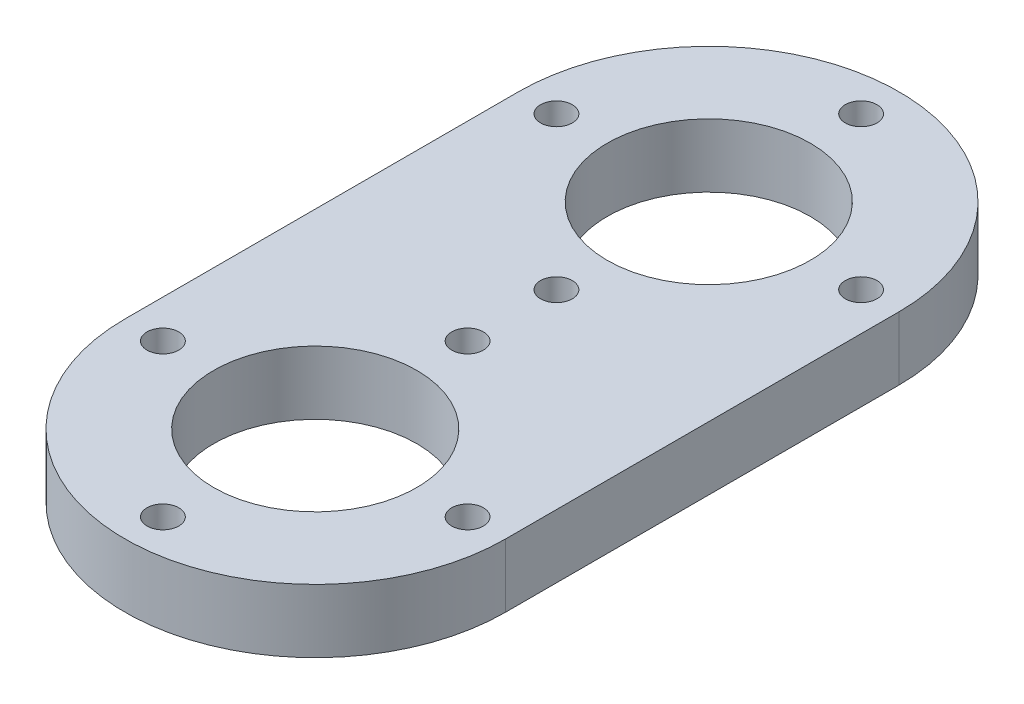
ISO-10303-21;
HEADER;
FILE_DESCRIPTION(('STEP AP214'),'2;1');
FILE_NAME('part.step','',(''),(''),'','','');
FILE_SCHEMA(('AUTOMOTIVE_DESIGN { 1 0 10303 214 1 1 1 1 }'));
ENDSEC;
DATA;
#1=APPLICATION_CONTEXT('core data for automotive mechanical design processes');
#2=APPLICATION_PROTOCOL_DEFINITION('international standard','automotive_design',2000,#1);
#3=PRODUCT_CONTEXT('',#1,'mechanical');
#4=PRODUCT('Part','Part','',(#3));
#5=PRODUCT_RELATED_PRODUCT_CATEGORY('part','',(#4));
#6=PRODUCT_DEFINITION_FORMATION('','',#4);
#7=PRODUCT_DEFINITION_CONTEXT('part definition',#1,'design');
#8=PRODUCT_DEFINITION('design','',#6,#7);
#9=PRODUCT_DEFINITION_SHAPE('','',#8);
#10=(LENGTH_UNIT() NAMED_UNIT(*) SI_UNIT(.MILLI.,.METRE.));
#11=(NAMED_UNIT(*) PLANE_ANGLE_UNIT() SI_UNIT($,.RADIAN.));
#12=(NAMED_UNIT(*) SI_UNIT($,.STERADIAN.) SOLID_ANGLE_UNIT());
#13=UNCERTAINTY_MEASURE_WITH_UNIT(LENGTH_MEASURE(1.E-05),#10,'distance_accuracy_value','');
#14=(GEOMETRIC_REPRESENTATION_CONTEXT(3) GLOBAL_UNCERTAINTY_ASSIGNED_CONTEXT((#13)) GLOBAL_UNIT_ASSIGNED_CONTEXT((#10,
#11,#12)) REPRESENTATION_CONTEXT('',''));
#15=CARTESIAN_POINT('',(0.,0.,0.));
#16=DIRECTION('',(0.,0.,1.));
#17=DIRECTION('',(1.,0.,0.));
#18=AXIS2_PLACEMENT_3D('',#15,#16,#17);
#19=CARTESIAN_POINT('',(0.,10.,-31.));
#20=DIRECTION('',(0.,1.,0.));
#21=DIRECTION('',(0.,0.,1.));
#22=AXIS2_PLACEMENT_3D('',#19,#20,#21);
#23=PLANE('',#22);
#24=CARTESIAN_POINT('',(24.,10.,31.));
#25=DIRECTION('',(0.,-1.,0.));
#26=DIRECTION('',(0.,0.,-1.));
#27=AXIS2_PLACEMENT_3D('',#24,#25,#26);
#28=CIRCLE('',#27,2.5);
#29=CARTESIAN_POINT('',(24.,10.,28.5));
#30=VERTEX_POINT('',#29);
#31=EDGE_CURVE('E173',#30,#30,#28,.T.);
#32=ORIENTED_EDGE('',*,*,#31,.T.);
#33=EDGE_LOOP('',(#32));
#34=FACE_BOUND('',#33,.T.);
#35=CARTESIAN_POINT('',(0.,10.,55.));
#36=DIRECTION('',(0.,-1.,0.));
#37=DIRECTION('',(1.,0.,0.));
#38=AXIS2_PLACEMENT_3D('',#35,#36,#37);
#39=CIRCLE('',#38,2.5);
#40=CARTESIAN_POINT('',(2.49999999999991,10.,55.));
#41=VERTEX_POINT('',#40);
#42=EDGE_CURVE('E167',#41,#41,#39,.T.);
#43=ORIENTED_EDGE('',*,*,#42,.T.);
#44=EDGE_LOOP('',(#43));
#45=FACE_BOUND('',#44,.T.);
#46=CARTESIAN_POINT('',(-24.,10.,31.));
#47=DIRECTION('',(0.,-1.,0.));
#48=DIRECTION('',(0.,0.,1.));
#49=AXIS2_PLACEMENT_3D('',#46,#47,#48);
#50=CIRCLE('',#49,2.5);
#51=CARTESIAN_POINT('',(-24.,10.,33.5));
#52=VERTEX_POINT('',#51);
#53=EDGE_CURVE('E161',#52,#52,#50,.T.);
#54=ORIENTED_EDGE('',*,*,#53,.T.);
#55=EDGE_LOOP('',(#54));
#56=FACE_BOUND('',#55,.T.);
#57=CARTESIAN_POINT('',(2.39391839684799E-13,10.,7.));
#58=DIRECTION('',(0.,-1.,0.));
#59=DIRECTION('',(-1.,0.,0.));
#60=AXIS2_PLACEMENT_3D('',#57,#58,#59);
#61=CIRCLE('',#60,2.5);
#62=CARTESIAN_POINT('',(-2.49999999999976,10.,6.99999999999997));
#63=VERTEX_POINT('',#62);
#64=EDGE_CURVE('E155',#63,#63,#61,.T.);
#65=ORIENTED_EDGE('',*,*,#64,.T.);
#66=EDGE_LOOP('',(#65));
#67=FACE_BOUND('',#66,.T.);
#68=CARTESIAN_POINT('',(0.,10.,-55.));
#69=DIRECTION('',(0.,1.,0.));
#70=DIRECTION('',(1.,0.,0.));
#71=AXIS2_PLACEMENT_3D('',#68,#69,#70);
#72=CIRCLE('',#71,2.5);
#73=CARTESIAN_POINT('',(2.49999999999991,10.,-55.));
#74=VERTEX_POINT('',#73);
#75=EDGE_CURVE('E150',#74,#74,#72,.T.);
#76=ORIENTED_EDGE('',*,*,#75,.F.);
#77=EDGE_LOOP('',(#76));
#78=FACE_BOUND('',#77,.T.);
#79=CARTESIAN_POINT('',(-24.,10.,-31.));
#80=DIRECTION('',(0.,1.,0.));
#81=DIRECTION('',(0.,0.,-1.));
#82=AXIS2_PLACEMENT_3D('',#79,#80,#81);
#83=CIRCLE('',#82,2.5);
#84=CARTESIAN_POINT('',(-24.,10.,-33.5));
#85=VERTEX_POINT('',#84);
#86=EDGE_CURVE('E144',#85,#85,#83,.T.);
#87=ORIENTED_EDGE('',*,*,#86,.F.);
#88=EDGE_LOOP('',(#87));
#89=FACE_BOUND('',#88,.T.);
#90=CARTESIAN_POINT('',(2.39391839684799E-13,10.,-7.));
#91=DIRECTION('',(0.,1.,0.));
#92=DIRECTION('',(-1.,0.,0.));
#93=AXIS2_PLACEMENT_3D('',#90,#91,#92);
#94=CIRCLE('',#93,2.5);
#95=CARTESIAN_POINT('',(-2.49999999999976,10.,-6.99999999999997));
#96=VERTEX_POINT('',#95);
#97=EDGE_CURVE('E137',#96,#96,#94,.T.);
#98=ORIENTED_EDGE('',*,*,#97,.F.);
#99=EDGE_LOOP('',(#98));
#100=FACE_BOUND('',#99,.T.);
#101=CARTESIAN_POINT('',(24.,10.,-31.));
#102=DIRECTION('',(0.,1.,0.));
#103=DIRECTION('',(0.,0.,1.));
#104=AXIS2_PLACEMENT_3D('',#101,#102,#103);
#105=CIRCLE('',#104,2.5);
#106=CARTESIAN_POINT('',(24.,10.,-28.5));
#107=VERTEX_POINT('',#106);
#108=EDGE_CURVE('E131',#107,#107,#105,.T.);
#109=ORIENTED_EDGE('',*,*,#108,.F.);
#110=EDGE_LOOP('',(#109));
#111=FACE_BOUND('',#110,.T.);
#112=CARTESIAN_POINT('',(0.,10.,31.));
#113=DIRECTION('',(0.,1.,0.));
#114=DIRECTION('',(0.,0.,1.));
#115=AXIS2_PLACEMENT_3D('',#112,#113,#114);
#116=CIRCLE('',#115,16.);
#117=CARTESIAN_POINT('',(0.,10.,47.));
#118=VERTEX_POINT('',#117);
#119=EDGE_CURVE('E107',#118,#118,#116,.T.);
#120=ORIENTED_EDGE('',*,*,#119,.F.);
#121=EDGE_LOOP('',(#120));
#122=FACE_BOUND('',#121,.T.);
#123=CARTESIAN_POINT('',(0.,10.,-31.));
#124=DIRECTION('',(0.,1.,0.));
#125=DIRECTION('',(0.,0.,1.));
#126=AXIS2_PLACEMENT_3D('',#123,#124,#125);
#127=CIRCLE('',#126,30.);
#128=CARTESIAN_POINT('',(30.,10.,-31.));
#129=VERTEX_POINT('',#128);
#130=CARTESIAN_POINT('',(-30.,10.,-31.));
#131=VERTEX_POINT('',#130);
#132=EDGE_CURVE('E92',#129,#131,#127,.T.);
#133=ORIENTED_EDGE('',*,*,#132,.T.);
#134=DIRECTION('',(0.,0.,1.));
#135=VECTOR('',#134,1.);
#136=CARTESIAN_POINT('',(-30.,10.,-31.));
#137=LINE('',#136,#135);
#138=CARTESIAN_POINT('',(-30.,10.,31.));
#139=VERTEX_POINT('',#138);
#140=EDGE_CURVE('E87',#131,#139,#137,.T.);
#141=ORIENTED_EDGE('',*,*,#140,.T.);
#142=CARTESIAN_POINT('',(0.,10.,31.));
#143=DIRECTION('',(0.,1.,0.));
#144=DIRECTION('',(0.,0.,1.));
#145=AXIS2_PLACEMENT_3D('',#142,#143,#144);
#146=CIRCLE('',#145,30.);
#147=CARTESIAN_POINT('',(30.,10.,31.));
#148=VERTEX_POINT('',#147);
#149=EDGE_CURVE('E90',#139,#148,#146,.T.);
#150=ORIENTED_EDGE('',*,*,#149,.T.);
#151=DIRECTION('',(0.,0.,-1.));
#152=VECTOR('',#151,1.);
#153=CARTESIAN_POINT('',(30.,10.,-31.));
#154=LINE('',#153,#152);
#155=EDGE_CURVE('E57',#148,#129,#154,.T.);
#156=ORIENTED_EDGE('',*,*,#155,.T.);
#157=EDGE_LOOP('',(#133,#141,#150,#156));
#158=FACE_BOUND('',#157,.T.);
#159=CARTESIAN_POINT('',(0.,10.,-31.));
#160=DIRECTION('',(0.,1.,0.));
#161=DIRECTION('',(0.,0.,1.));
#162=AXIS2_PLACEMENT_3D('',#159,#160,#161);
#163=CIRCLE('',#162,16.);
#164=CARTESIAN_POINT('',(0.,10.,-15.));
#165=VERTEX_POINT('',#164);
#166=EDGE_CURVE('E122',#165,#165,#163,.T.);
#167=ORIENTED_EDGE('',*,*,#166,.F.);
#168=EDGE_LOOP('',(#167));
#169=FACE_BOUND('',#168,.T.);
#170=ADVANCED_FACE('F40',(#34,#45,#56,#67,#78,#89,#100,#111,#122,#158,#169),#23,.T.);
#171=CARTESIAN_POINT('',(0.,0.,-31.));
#172=DIRECTION('',(0.,1.,0.));
#173=DIRECTION('',(0.,0.,1.));
#174=AXIS2_PLACEMENT_3D('',#171,#172,#173);
#175=PLANE('',#174);
#176=CARTESIAN_POINT('',(24.,0.,31.));
#177=DIRECTION('',(0.,-1.,0.));
#178=DIRECTION('',(0.,0.,-1.));
#179=AXIS2_PLACEMENT_3D('',#176,#177,#178);
#180=CIRCLE('',#179,2.5);
#181=CARTESIAN_POINT('',(24.,0.,28.5));
#182=VERTEX_POINT('',#181);
#183=EDGE_CURVE('E141',#182,#182,#180,.T.);
#184=ORIENTED_EDGE('',*,*,#183,.F.);
#185=EDGE_LOOP('',(#184));
#186=FACE_BOUND('',#185,.T.);
#187=CARTESIAN_POINT('',(0.,0.,55.));
#188=DIRECTION('',(0.,-1.,0.));
#189=DIRECTION('',(1.,0.,0.));
#190=AXIS2_PLACEMENT_3D('',#187,#188,#189);
#191=CIRCLE('',#190,2.5);
#192=CARTESIAN_POINT('',(2.49999999999991,0.,55.));
#193=VERTEX_POINT('',#192);
#194=EDGE_CURVE('E170',#193,#193,#191,.T.);
#195=ORIENTED_EDGE('',*,*,#194,.F.);
#196=EDGE_LOOP('',(#195));
#197=FACE_BOUND('',#196,.T.);
#198=CARTESIAN_POINT('',(-24.,0.,31.));
#199=DIRECTION('',(0.,-1.,0.));
#200=DIRECTION('',(0.,0.,1.));
#201=AXIS2_PLACEMENT_3D('',#198,#199,#200);
#202=CIRCLE('',#201,2.5);
#203=CARTESIAN_POINT('',(-24.,0.,33.5));
#204=VERTEX_POINT('',#203);
#205=EDGE_CURVE('E164',#204,#204,#202,.T.);
#206=ORIENTED_EDGE('',*,*,#205,.F.);
#207=EDGE_LOOP('',(#206));
#208=FACE_BOUND('',#207,.T.);
#209=CARTESIAN_POINT('',(2.39391839684799E-13,0.,7.));
#210=DIRECTION('',(0.,-1.,0.));
#211=DIRECTION('',(-1.,0.,0.));
#212=AXIS2_PLACEMENT_3D('',#209,#210,#211);
#213=CIRCLE('',#212,2.5);
#214=CARTESIAN_POINT('',(-2.49999999999976,0.,6.99999999999997));
#215=VERTEX_POINT('',#214);
#216=EDGE_CURVE('E158',#215,#215,#213,.T.);
#217=ORIENTED_EDGE('',*,*,#216,.F.);
#218=EDGE_LOOP('',(#217));
#219=FACE_BOUND('',#218,.T.);
#220=CARTESIAN_POINT('',(0.,0.,-55.));
#221=DIRECTION('',(0.,1.,0.));
#222=DIRECTION('',(1.,0.,0.));
#223=AXIS2_PLACEMENT_3D('',#220,#221,#222);
#224=CIRCLE('',#223,2.5);
#225=CARTESIAN_POINT('',(2.49999999999991,0.,-55.));
#226=VERTEX_POINT('',#225);
#227=EDGE_CURVE('E134',#226,#226,#224,.T.);
#228=ORIENTED_EDGE('',*,*,#227,.T.);
#229=EDGE_LOOP('',(#228));
#230=FACE_BOUND('',#229,.T.);
#231=CARTESIAN_POINT('',(-24.,0.,-31.));
#232=DIRECTION('',(0.,1.,0.));
#233=DIRECTION('',(0.,0.,-1.));
#234=AXIS2_PLACEMENT_3D('',#231,#232,#233);
#235=CIRCLE('',#234,2.5);
#236=CARTESIAN_POINT('',(-24.,0.,-33.5));
#237=VERTEX_POINT('',#236);
#238=EDGE_CURVE('E147',#237,#237,#235,.T.);
#239=ORIENTED_EDGE('',*,*,#238,.T.);
#240=EDGE_LOOP('',(#239));
#241=FACE_BOUND('',#240,.T.);
#242=CARTESIAN_POINT('',(2.39391839684799E-13,0.,-7.));
#243=DIRECTION('',(0.,1.,0.));
#244=DIRECTION('',(-1.,0.,0.));
#245=AXIS2_PLACEMENT_3D('',#242,#243,#244);
#246=CIRCLE('',#245,2.5);
#247=CARTESIAN_POINT('',(-2.49999999999976,0.,-6.99999999999997));
#248=VERTEX_POINT('',#247);
#249=EDGE_CURVE('E140',#248,#248,#246,.T.);
#250=ORIENTED_EDGE('',*,*,#249,.T.);
#251=EDGE_LOOP('',(#250));
#252=FACE_BOUND('',#251,.T.);
#253=CARTESIAN_POINT('',(24.,0.,-31.));
#254=DIRECTION('',(0.,1.,0.));
#255=DIRECTION('',(0.,0.,1.));
#256=AXIS2_PLACEMENT_3D('',#253,#254,#255);
#257=CIRCLE('',#256,2.5);
#258=CARTESIAN_POINT('',(24.,0.,-28.5));
#259=VERTEX_POINT('',#258);
#260=EDGE_CURVE('E128',#259,#259,#257,.T.);
#261=ORIENTED_EDGE('',*,*,#260,.T.);
#262=EDGE_LOOP('',(#261));
#263=FACE_BOUND('',#262,.T.);
#264=CARTESIAN_POINT('',(0.,0.,-31.));
#265=DIRECTION('',(0.,1.,0.));
#266=DIRECTION('',(0.,0.,1.));
#267=AXIS2_PLACEMENT_3D('',#264,#265,#266);
#268=CIRCLE('',#267,30.);
#269=CARTESIAN_POINT('',(30.,0.,-31.));
#270=VERTEX_POINT('',#269);
#271=CARTESIAN_POINT('',(-30.,0.,-31.));
#272=VERTEX_POINT('',#271);
#273=EDGE_CURVE('E104',#270,#272,#268,.T.);
#274=ORIENTED_EDGE('',*,*,#273,.F.);
#275=DIRECTION('',(0.,0.,-1.));
#276=VECTOR('',#275,1.);
#277=CARTESIAN_POINT('',(30.,0.,-31.));
#278=LINE('',#277,#276);
#279=CARTESIAN_POINT('',(30.,0.,31.));
#280=VERTEX_POINT('',#279);
#281=EDGE_CURVE('E80',#280,#270,#278,.T.);
#282=ORIENTED_EDGE('',*,*,#281,.F.);
#283=CARTESIAN_POINT('',(0.,0.,31.));
#284=DIRECTION('',(0.,1.,0.));
#285=DIRECTION('',(0.,0.,1.));
#286=AXIS2_PLACEMENT_3D('',#283,#284,#285);
#287=CIRCLE('',#286,30.);
#288=CARTESIAN_POINT('',(-30.,0.,31.));
#289=VERTEX_POINT('',#288);
#290=EDGE_CURVE('E74',#289,#280,#287,.T.);
#291=ORIENTED_EDGE('',*,*,#290,.F.);
#292=DIRECTION('',(0.,0.,1.));
#293=VECTOR('',#292,1.);
#294=CARTESIAN_POINT('',(-30.,0.,-31.));
#295=LINE('',#294,#293);
#296=EDGE_CURVE('E96',#272,#289,#295,.T.);
#297=ORIENTED_EDGE('',*,*,#296,.F.);
#298=EDGE_LOOP('',(#274,#282,#291,#297));
#299=FACE_BOUND('',#298,.T.);
#300=CARTESIAN_POINT('',(0.,0.,31.));
#301=DIRECTION('',(0.,1.,0.));
#302=DIRECTION('',(0.,0.,1.));
#303=AXIS2_PLACEMENT_3D('',#300,#301,#302);
#304=CIRCLE('',#303,16.);
#305=CARTESIAN_POINT('',(0.,0.,47.));
#306=VERTEX_POINT('',#305);
#307=EDGE_CURVE('E119',#306,#306,#304,.T.);
#308=ORIENTED_EDGE('',*,*,#307,.T.);
#309=EDGE_LOOP('',(#308));
#310=FACE_BOUND('',#309,.T.);
#311=CARTESIAN_POINT('',(0.,0.,-31.));
#312=DIRECTION('',(0.,1.,0.));
#313=DIRECTION('',(0.,0.,1.));
#314=AXIS2_PLACEMENT_3D('',#311,#312,#313);
#315=CIRCLE('',#314,16.);
#316=CARTESIAN_POINT('',(0.,0.,-15.));
#317=VERTEX_POINT('',#316);
#318=EDGE_CURVE('E125',#317,#317,#315,.T.);
#319=ORIENTED_EDGE('',*,*,#318,.T.);
#320=EDGE_LOOP('',(#319));
#321=FACE_BOUND('',#320,.T.);
#322=ADVANCED_FACE('F115',(#186,#197,#208,#219,#230,#241,#252,#263,#299,#310,#321),#175,.F.);
#323=CARTESIAN_POINT('',(0.,10.,-31.));
#324=DIRECTION('',(0.,-1.,0.));
#325=DIRECTION('',(0.,0.,-1.));
#326=AXIS2_PLACEMENT_3D('',#323,#324,#325);
#327=CYLINDRICAL_SURFACE('',#326,30.);
#328=ORIENTED_EDGE('',*,*,#273,.T.);
#329=DIRECTION('',(0.,-1.,0.));
#330=VECTOR('',#329,1.);
#331=CARTESIAN_POINT('',(-30.,10.,-31.));
#332=LINE('',#331,#330);
#333=EDGE_CURVE('E11',#131,#272,#332,.T.);
#334=ORIENTED_EDGE('',*,*,#333,.F.);
#335=ORIENTED_EDGE('',*,*,#132,.F.);
#336=DIRECTION('',(0.,-1.,0.));
#337=VECTOR('',#336,1.);
#338=CARTESIAN_POINT('',(30.,10.,-31.));
#339=LINE('',#338,#337);
#340=EDGE_CURVE('E100',#129,#270,#339,.T.);
#341=ORIENTED_EDGE('',*,*,#340,.T.);
#342=EDGE_LOOP('',(#328,#334,#335,#341));
#343=FACE_BOUND('',#342,.T.);
#344=ADVANCED_FACE('F42',(#343),#327,.T.);
#345=CARTESIAN_POINT('',(-30.,10.,-31.));
#346=DIRECTION('',(1.,0.,0.));
#347=DIRECTION('',(0.,0.,-1.));
#348=AXIS2_PLACEMENT_3D('',#345,#346,#347);
#349=PLANE('',#348);
#350=ORIENTED_EDGE('',*,*,#296,.T.);
#351=DIRECTION('',(0.,-1.,0.));
#352=VECTOR('',#351,1.);
#353=CARTESIAN_POINT('',(-30.,10.,31.));
#354=LINE('',#353,#352);
#355=EDGE_CURVE('E49',#139,#289,#354,.T.);
#356=ORIENTED_EDGE('',*,*,#355,.F.);
#357=ORIENTED_EDGE('',*,*,#140,.F.);
#358=ORIENTED_EDGE('',*,*,#333,.T.);
#359=EDGE_LOOP('',(#350,#356,#357,#358));
#360=FACE_BOUND('',#359,.T.);
#361=ADVANCED_FACE('F95',(#360),#349,.F.);
#362=CARTESIAN_POINT('',(0.,10.,31.));
#363=DIRECTION('',(0.,-1.,0.));
#364=DIRECTION('',(0.,0.,-1.));
#365=AXIS2_PLACEMENT_3D('',#362,#363,#364);
#366=CYLINDRICAL_SURFACE('',#365,30.);
#367=ORIENTED_EDGE('',*,*,#290,.T.);
#368=DIRECTION('',(0.,-1.,0.));
#369=VECTOR('',#368,1.);
#370=CARTESIAN_POINT('',(30.,10.,31.));
#371=LINE('',#370,#369);
#372=EDGE_CURVE('E97',#148,#280,#371,.T.);
#373=ORIENTED_EDGE('',*,*,#372,.F.);
#374=ORIENTED_EDGE('',*,*,#149,.F.);
#375=ORIENTED_EDGE('',*,*,#355,.T.);
#376=EDGE_LOOP('',(#367,#373,#374,#375));
#377=FACE_BOUND('',#376,.T.);
#378=ADVANCED_FACE('F98',(#377),#366,.T.);
#379=CARTESIAN_POINT('',(30.,10.,-31.));
#380=DIRECTION('',(-1.,0.,0.));
#381=DIRECTION('',(0.,0.,1.));
#382=AXIS2_PLACEMENT_3D('',#379,#380,#381);
#383=PLANE('',#382);
#384=ORIENTED_EDGE('',*,*,#281,.T.);
#385=ORIENTED_EDGE('',*,*,#340,.F.);
#386=ORIENTED_EDGE('',*,*,#155,.F.);
#387=ORIENTED_EDGE('',*,*,#372,.T.);
#388=EDGE_LOOP('',(#384,#385,#386,#387));
#389=FACE_BOUND('',#388,.T.);
#390=ADVANCED_FACE('F112',(#389),#383,.F.);
#391=CARTESIAN_POINT('',(0.,10.,31.));
#392=DIRECTION('',(0.,-1.,0.));
#393=DIRECTION('',(0.,0.,-1.));
#394=AXIS2_PLACEMENT_3D('',#391,#392,#393);
#395=CYLINDRICAL_SURFACE('',#394,16.);
#396=ORIENTED_EDGE('',*,*,#119,.T.);
#397=EDGE_LOOP('',(#396));
#398=FACE_BOUND('',#397,.T.);
#399=ORIENTED_EDGE('',*,*,#307,.F.);
#400=EDGE_LOOP('',(#399));
#401=FACE_BOUND('',#400,.T.);
#402=ADVANCED_FACE('F213',(#398,#401),#395,.F.);
#403=CARTESIAN_POINT('',(0.,10.,-31.));
#404=DIRECTION('',(0.,-1.,0.));
#405=DIRECTION('',(0.,0.,-1.));
#406=AXIS2_PLACEMENT_3D('',#403,#404,#405);
#407=CYLINDRICAL_SURFACE('',#406,16.);
#408=ORIENTED_EDGE('',*,*,#166,.T.);
#409=EDGE_LOOP('',(#408));
#410=FACE_BOUND('',#409,.T.);
#411=ORIENTED_EDGE('',*,*,#318,.F.);
#412=EDGE_LOOP('',(#411));
#413=FACE_BOUND('',#412,.T.);
#414=ADVANCED_FACE('F203',(#410,#413),#407,.F.);
#415=CARTESIAN_POINT('',(24.,0.,-31.));
#416=DIRECTION('',(0.,1.,0.));
#417=DIRECTION('',(0.,0.,1.));
#418=AXIS2_PLACEMENT_3D('',#415,#416,#417);
#419=CYLINDRICAL_SURFACE('',#418,2.5);
#420=ORIENTED_EDGE('',*,*,#260,.F.);
#421=EDGE_LOOP('',(#420));
#422=FACE_BOUND('',#421,.T.);
#423=ORIENTED_EDGE('',*,*,#108,.T.);
#424=EDGE_LOOP('',(#423));
#425=FACE_BOUND('',#424,.T.);
#426=ADVANCED_FACE('F199',(#422,#425),#419,.F.);
#427=CARTESIAN_POINT('',(2.39391839684799E-13,0.,-7.));
#428=DIRECTION('',(0.,1.,0.));
#429=DIRECTION('',(0.,0.,1.));
#430=AXIS2_PLACEMENT_3D('',#427,#428,#429);
#431=CYLINDRICAL_SURFACE('',#430,2.5);
#432=ORIENTED_EDGE('',*,*,#249,.F.);
#433=EDGE_LOOP('',(#432));
#434=FACE_BOUND('',#433,.T.);
#435=ORIENTED_EDGE('',*,*,#97,.T.);
#436=EDGE_LOOP('',(#435));
#437=FACE_BOUND('',#436,.T.);
#438=ADVANCED_FACE('F202',(#434,#437),#431,.F.);
#439=CARTESIAN_POINT('',(-24.,0.,-31.));
#440=DIRECTION('',(0.,1.,0.));
#441=DIRECTION('',(0.,0.,1.));
#442=AXIS2_PLACEMENT_3D('',#439,#440,#441);
#443=CYLINDRICAL_SURFACE('',#442,2.5);
#444=ORIENTED_EDGE('',*,*,#238,.F.);
#445=EDGE_LOOP('',(#444));
#446=FACE_BOUND('',#445,.T.);
#447=ORIENTED_EDGE('',*,*,#86,.T.);
#448=EDGE_LOOP('',(#447));
#449=FACE_BOUND('',#448,.T.);
#450=ADVANCED_FACE('F258',(#446,#449),#443,.F.);
#451=CARTESIAN_POINT('',(0.,0.,-55.));
#452=DIRECTION('',(0.,1.,0.));
#453=DIRECTION('',(0.,0.,1.));
#454=AXIS2_PLACEMENT_3D('',#451,#452,#453);
#455=CYLINDRICAL_SURFACE('',#454,2.5);
#456=ORIENTED_EDGE('',*,*,#227,.F.);
#457=EDGE_LOOP('',(#456));
#458=FACE_BOUND('',#457,.T.);
#459=ORIENTED_EDGE('',*,*,#75,.T.);
#460=EDGE_LOOP('',(#459));
#461=FACE_BOUND('',#460,.T.);
#462=ADVANCED_FACE('F252',(#458,#461),#455,.F.);
#463=CARTESIAN_POINT('',(2.39391839684799E-13,0.,7.));
#464=DIRECTION('',(0.,1.,0.));
#465=DIRECTION('',(0.,0.,1.));
#466=AXIS2_PLACEMENT_3D('',#463,#464,#465);
#467=CYLINDRICAL_SURFACE('',#466,2.5);
#468=ORIENTED_EDGE('',*,*,#216,.T.);
#469=EDGE_LOOP('',(#468));
#470=FACE_BOUND('',#469,.T.);
#471=ORIENTED_EDGE('',*,*,#64,.F.);
#472=EDGE_LOOP('',(#471));
#473=FACE_BOUND('',#472,.T.);
#474=ADVANCED_FACE('F257',(#470,#473),#467,.F.);
#475=CARTESIAN_POINT('',(-24.,0.,31.));
#476=DIRECTION('',(0.,1.,0.));
#477=DIRECTION('',(0.,0.,1.));
#478=AXIS2_PLACEMENT_3D('',#475,#476,#477);
#479=CYLINDRICAL_SURFACE('',#478,2.5);
#480=ORIENTED_EDGE('',*,*,#205,.T.);
#481=EDGE_LOOP('',(#480));
#482=FACE_BOUND('',#481,.T.);
#483=ORIENTED_EDGE('',*,*,#53,.F.);
#484=EDGE_LOOP('',(#483));
#485=FACE_BOUND('',#484,.T.);
#486=ADVANCED_FACE('F344',(#482,#485),#479,.F.);
#487=CARTESIAN_POINT('',(0.,0.,55.));
#488=DIRECTION('',(0.,1.,0.));
#489=DIRECTION('',(0.,0.,1.));
#490=AXIS2_PLACEMENT_3D('',#487,#488,#489);
#491=CYLINDRICAL_SURFACE('',#490,2.5);
#492=ORIENTED_EDGE('',*,*,#194,.T.);
#493=EDGE_LOOP('',(#492));
#494=FACE_BOUND('',#493,.T.);
#495=ORIENTED_EDGE('',*,*,#42,.F.);
#496=EDGE_LOOP('',(#495));
#497=FACE_BOUND('',#496,.T.);
#498=ADVANCED_FACE('F353',(#494,#497),#491,.F.);
#499=CARTESIAN_POINT('',(24.,0.,31.));
#500=DIRECTION('',(0.,1.,0.));
#501=DIRECTION('',(0.,0.,1.));
#502=AXIS2_PLACEMENT_3D('',#499,#500,#501);
#503=CYLINDRICAL_SURFACE('',#502,2.5);
#504=ORIENTED_EDGE('',*,*,#183,.T.);
#505=EDGE_LOOP('',(#504));
#506=FACE_BOUND('',#505,.T.);
#507=ORIENTED_EDGE('',*,*,#31,.F.);
#508=EDGE_LOOP('',(#507));
#509=FACE_BOUND('',#508,.T.);
#510=ADVANCED_FACE('F179',(#506,#509),#503,.F.);
#511=CLOSED_SHELL('',(#170,#322,#344,#361,#378,#390,#402,#414,#426,#438,#450,#462,#474,#486,
#498,#510));
#512=MANIFOLD_SOLID_BREP('B2',#511);
#513=ADVANCED_BREP_SHAPE_REPRESENTATION('',(#18,#512),#14);
#514=SHAPE_DEFINITION_REPRESENTATION(#9,#513);
ENDSEC;
END-ISO-10303-21;
